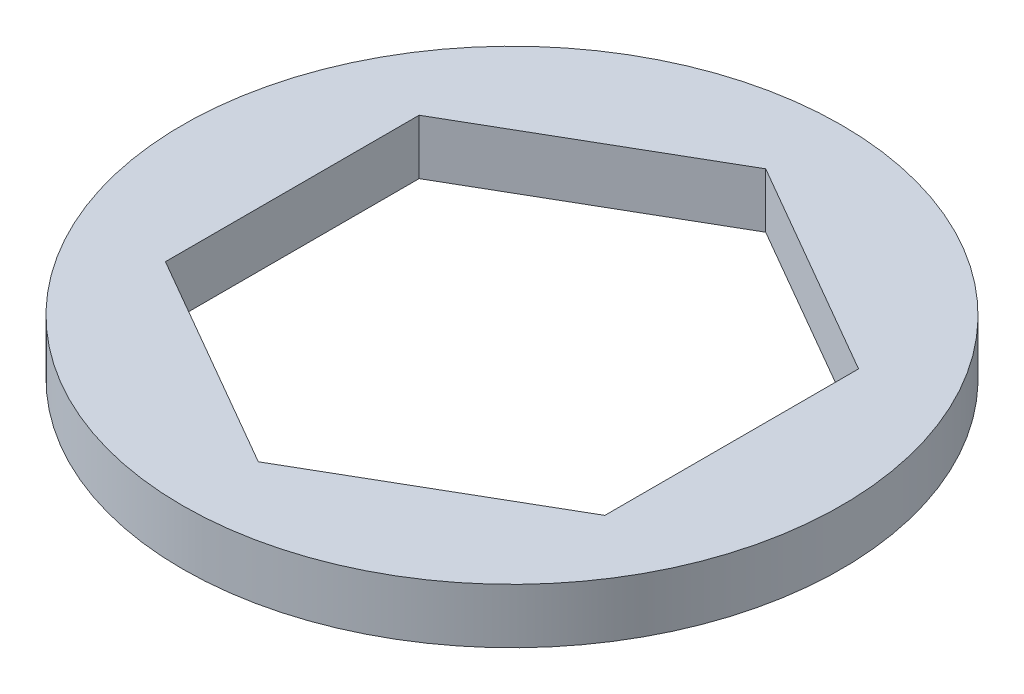
ISO-10303-21;
HEADER;
FILE_DESCRIPTION(('STEP AP214'),'2;1');
FILE_NAME('part.step','',(''),(''),'','','');
FILE_SCHEMA(('AUTOMOTIVE_DESIGN { 1 0 10303 214 1 1 1 1 }'));
ENDSEC;
DATA;
#1=APPLICATION_CONTEXT('core data for automotive mechanical design processes');
#2=APPLICATION_PROTOCOL_DEFINITION('international standard','automotive_design',2000,#1);
#3=PRODUCT_CONTEXT('',#1,'mechanical');
#4=PRODUCT('Part','Part','',(#3));
#5=PRODUCT_RELATED_PRODUCT_CATEGORY('part','',(#4));
#6=PRODUCT_DEFINITION_FORMATION('','',#4);
#7=PRODUCT_DEFINITION_CONTEXT('part definition',#1,'design');
#8=PRODUCT_DEFINITION('design','',#6,#7);
#9=PRODUCT_DEFINITION_SHAPE('','',#8);
#10=(LENGTH_UNIT() NAMED_UNIT(*) SI_UNIT(.MILLI.,.METRE.));
#11=(NAMED_UNIT(*) PLANE_ANGLE_UNIT() SI_UNIT($,.RADIAN.));
#12=(NAMED_UNIT(*) SI_UNIT($,.STERADIAN.) SOLID_ANGLE_UNIT());
#13=UNCERTAINTY_MEASURE_WITH_UNIT(LENGTH_MEASURE(1.E-05),#10,'distance_accuracy_value','');
#14=(GEOMETRIC_REPRESENTATION_CONTEXT(3) GLOBAL_UNCERTAINTY_ASSIGNED_CONTEXT((#13)) GLOBAL_UNIT_ASSIGNED_CONTEXT((#10,
#11,#12)) REPRESENTATION_CONTEXT('',''));
#15=CARTESIAN_POINT('',(0.,0.,0.));
#16=DIRECTION('',(0.,0.,1.));
#17=DIRECTION('',(1.,0.,0.));
#18=AXIS2_PLACEMENT_3D('',#15,#16,#17);
#19=CARTESIAN_POINT('',(0.,1.5875,0.));
#20=DIRECTION('',(0.,1.,0.));
#21=DIRECTION('',(0.,0.,1.));
#22=AXIS2_PLACEMENT_3D('',#19,#20,#21);
#23=PLANE('',#22);
#24=CARTESIAN_POINT('',(0.,1.5875,0.));
#25=DIRECTION('',(0.,1.,0.));
#26=DIRECTION('',(0.,0.,1.));
#27=AXIS2_PLACEMENT_3D('',#24,#25,#26);
#28=CIRCLE('',#27,9.525);
#29=CARTESIAN_POINT('',(0.,1.5875,9.525));
#30=VERTEX_POINT('',#29);
#31=EDGE_CURVE('E11',#30,#30,#28,.T.);
#32=ORIENTED_EDGE('',*,*,#31,.T.);
#33=EDGE_LOOP('',(#32));
#34=FACE_BOUND('',#33,.T.);
#35=DIRECTION('',(-0.866025403784439,0.,-0.5));
#36=VECTOR('',#35,1.);
#37=CARTESIAN_POINT('',(6.35,1.5875,-3.66617420935412));
#38=LINE('',#37,#36);
#39=CARTESIAN_POINT('',(6.35,1.5875,-3.66617420935412));
#40=VERTEX_POINT('',#39);
#41=CARTESIAN_POINT('',(0.,1.5875,-7.33234841870825));
#42=VERTEX_POINT('',#41);
#43=EDGE_CURVE('E98',#40,#42,#38,.T.);
#44=ORIENTED_EDGE('',*,*,#43,.F.);
#45=DIRECTION('',(0.,0.,-1.));
#46=VECTOR('',#45,1.);
#47=CARTESIAN_POINT('',(6.35,1.5875,3.66617420935412));
#48=LINE('',#47,#46);
#49=CARTESIAN_POINT('',(6.35,1.5875,3.66617420935412));
#50=VERTEX_POINT('',#49);
#51=EDGE_CURVE('E90',#50,#40,#48,.T.);
#52=ORIENTED_EDGE('',*,*,#51,.F.);
#53=DIRECTION('',(0.866025403784438,0.,-0.5));
#54=VECTOR('',#53,1.);
#55=CARTESIAN_POINT('',(0.,1.5875,7.33234841870825));
#56=LINE('',#55,#54);
#57=CARTESIAN_POINT('',(0.,1.5875,7.33234841870825));
#58=VERTEX_POINT('',#57);
#59=EDGE_CURVE('E118',#58,#50,#56,.T.);
#60=ORIENTED_EDGE('',*,*,#59,.F.);
#61=DIRECTION('',(0.866025403784439,0.,0.5));
#62=VECTOR('',#61,1.);
#63=CARTESIAN_POINT('',(-6.35,1.5875,3.66617420935413));
#64=LINE('',#63,#62);
#65=CARTESIAN_POINT('',(-6.35,1.5875,3.66617420935413));
#66=VERTEX_POINT('',#65);
#67=EDGE_CURVE('E116',#66,#58,#64,.T.);
#68=ORIENTED_EDGE('',*,*,#67,.F.);
#69=DIRECTION('',(0.,0.,1.));
#70=VECTOR('',#69,1.);
#71=CARTESIAN_POINT('',(-6.35,1.5875,-3.66617420935412));
#72=LINE('',#71,#70);
#73=CARTESIAN_POINT('',(-6.35,1.5875,-3.66617420935412));
#74=VERTEX_POINT('',#73);
#75=EDGE_CURVE('E112',#74,#66,#72,.T.);
#76=ORIENTED_EDGE('',*,*,#75,.F.);
#77=DIRECTION('',(-0.866025403784438,0.,0.5));
#78=VECTOR('',#77,1.);
#79=CARTESIAN_POINT('',(0.,1.5875,-7.33234841870825));
#80=LINE('',#79,#78);
#81=EDGE_CURVE('E110',#42,#74,#80,.T.);
#82=ORIENTED_EDGE('',*,*,#81,.F.);
#83=EDGE_LOOP('',(#44,#52,#60,#68,#76,#82));
#84=FACE_BOUND('',#83,.T.);
#85=ADVANCED_FACE('F37',(#34,#84),#23,.T.);
#86=CARTESIAN_POINT('',(0.,0.,0.));
#87=DIRECTION('',(0.,1.,0.));
#88=DIRECTION('',(0.,0.,1.));
#89=AXIS2_PLACEMENT_3D('',#86,#87,#88);
#90=PLANE('',#89);
#91=CARTESIAN_POINT('',(0.,0.,0.));
#92=DIRECTION('',(0.,1.,0.));
#93=DIRECTION('',(0.,0.,1.));
#94=AXIS2_PLACEMENT_3D('',#91,#92,#93);
#95=CIRCLE('',#94,9.525);
#96=CARTESIAN_POINT('',(0.,0.,9.525));
#97=VERTEX_POINT('',#96);
#98=EDGE_CURVE('E41',#97,#97,#95,.T.);
#99=ORIENTED_EDGE('',*,*,#98,.F.);
#100=EDGE_LOOP('',(#99));
#101=FACE_BOUND('',#100,.T.);
#102=DIRECTION('',(0.,0.,-1.));
#103=VECTOR('',#102,1.);
#104=CARTESIAN_POINT('',(6.35,0.,3.66617420935412));
#105=LINE('',#104,#103);
#106=CARTESIAN_POINT('',(6.35,0.,3.66617420935412));
#107=VERTEX_POINT('',#106);
#108=CARTESIAN_POINT('',(6.35,0.,-3.66617420935412));
#109=VERTEX_POINT('',#108);
#110=EDGE_CURVE('E60',#107,#109,#105,.T.);
#111=ORIENTED_EDGE('',*,*,#110,.T.);
#112=DIRECTION('',(-0.866025403784439,0.,-0.5));
#113=VECTOR('',#112,1.);
#114=CARTESIAN_POINT('',(6.35,0.,-3.66617420935412));
#115=LINE('',#114,#113);
#116=CARTESIAN_POINT('',(0.,0.,-7.33234841870825));
#117=VERTEX_POINT('',#116);
#118=EDGE_CURVE('E105',#109,#117,#115,.T.);
#119=ORIENTED_EDGE('',*,*,#118,.T.);
#120=DIRECTION('',(-0.866025403784438,0.,0.5));
#121=VECTOR('',#120,1.);
#122=CARTESIAN_POINT('',(0.,0.,-7.33234841870825));
#123=LINE('',#122,#121);
#124=CARTESIAN_POINT('',(-6.35,0.,-3.66617420935412));
#125=VERTEX_POINT('',#124);
#126=EDGE_CURVE('E122',#117,#125,#123,.T.);
#127=ORIENTED_EDGE('',*,*,#126,.T.);
#128=DIRECTION('',(0.,0.,1.));
#129=VECTOR('',#128,1.);
#130=CARTESIAN_POINT('',(-6.35,0.,-3.66617420935412));
#131=LINE('',#130,#129);
#132=CARTESIAN_POINT('',(-6.35,0.,3.66617420935413));
#133=VERTEX_POINT('',#132);
#134=EDGE_CURVE('E125',#125,#133,#131,.T.);
#135=ORIENTED_EDGE('',*,*,#134,.T.);
#136=DIRECTION('',(0.866025403784439,0.,0.5));
#137=VECTOR('',#136,1.);
#138=CARTESIAN_POINT('',(-6.35,0.,3.66617420935413));
#139=LINE('',#138,#137);
#140=CARTESIAN_POINT('',(0.,0.,7.33234841870825));
#141=VERTEX_POINT('',#140);
#142=EDGE_CURVE('E128',#133,#141,#139,.T.);
#143=ORIENTED_EDGE('',*,*,#142,.T.);
#144=DIRECTION('',(0.866025403784438,0.,-0.5));
#145=VECTOR('',#144,1.);
#146=CARTESIAN_POINT('',(0.,0.,7.33234841870825));
#147=LINE('',#146,#145);
#148=EDGE_CURVE('E99',#141,#107,#147,.T.);
#149=ORIENTED_EDGE('',*,*,#148,.T.);
#150=EDGE_LOOP('',(#111,#119,#127,#135,#143,#149));
#151=FACE_BOUND('',#150,.T.);
#152=ADVANCED_FACE('F145',(#101,#151),#90,.F.);
#153=CARTESIAN_POINT('',(0.,1.5875,0.));
#154=DIRECTION('',(0.,-1.,0.));
#155=DIRECTION('',(0.,0.,-1.));
#156=AXIS2_PLACEMENT_3D('',#153,#154,#155);
#157=CYLINDRICAL_SURFACE('',#156,9.525);
#158=ORIENTED_EDGE('',*,*,#31,.F.);
#159=EDGE_LOOP('',(#158));
#160=FACE_BOUND('',#159,.T.);
#161=ORIENTED_EDGE('',*,*,#98,.T.);
#162=EDGE_LOOP('',(#161));
#163=FACE_BOUND('',#162,.T.);
#164=ADVANCED_FACE('F39',(#160,#163),#157,.T.);
#165=CARTESIAN_POINT('',(6.35,1.5875,3.66617420935412));
#166=DIRECTION('',(-1.,0.,0.));
#167=DIRECTION('',(0.,0.,1.));
#168=AXIS2_PLACEMENT_3D('',#165,#166,#167);
#169=PLANE('',#168);
#170=ORIENTED_EDGE('',*,*,#110,.F.);
#171=DIRECTION('',(0.,-1.,0.));
#172=VECTOR('',#171,1.);
#173=CARTESIAN_POINT('',(6.35,1.5875,3.66617420935412));
#174=LINE('',#173,#172);
#175=EDGE_CURVE('E94',#50,#107,#174,.T.);
#176=ORIENTED_EDGE('',*,*,#175,.F.);
#177=ORIENTED_EDGE('',*,*,#51,.T.);
#178=DIRECTION('',(0.,-1.,0.));
#179=VECTOR('',#178,1.);
#180=CARTESIAN_POINT('',(6.35,1.5875,-3.66617420935412));
#181=LINE('',#180,#179);
#182=EDGE_CURVE('E93',#40,#109,#181,.T.);
#183=ORIENTED_EDGE('',*,*,#182,.T.);
#184=EDGE_LOOP('',(#170,#176,#177,#183));
#185=FACE_BOUND('',#184,.T.);
#186=ADVANCED_FACE('F92',(#185),#169,.T.);
#187=CARTESIAN_POINT('',(6.35,1.5875,-3.66617420935412));
#188=DIRECTION('',(-0.5,0.,0.866025403784439));
#189=DIRECTION('',(0.866025403784439,0.,0.5));
#190=AXIS2_PLACEMENT_3D('',#187,#188,#189);
#191=PLANE('',#190);
#192=ORIENTED_EDGE('',*,*,#118,.F.);
#193=ORIENTED_EDGE('',*,*,#182,.F.);
#194=ORIENTED_EDGE('',*,*,#43,.T.);
#195=DIRECTION('',(0.,-1.,0.));
#196=VECTOR('',#195,1.);
#197=CARTESIAN_POINT('',(0.,1.5875,-7.33234841870825));
#198=LINE('',#197,#196);
#199=EDGE_CURVE('E106',#42,#117,#198,.T.);
#200=ORIENTED_EDGE('',*,*,#199,.T.);
#201=EDGE_LOOP('',(#192,#193,#194,#200));
#202=FACE_BOUND('',#201,.T.);
#203=ADVANCED_FACE('F102',(#202),#191,.T.);
#204=CARTESIAN_POINT('',(0.,1.5875,-7.33234841870825));
#205=DIRECTION('',(0.5,0.,0.866025403784438));
#206=DIRECTION('',(0.866025403784438,0.,-0.5));
#207=AXIS2_PLACEMENT_3D('',#204,#205,#206);
#208=PLANE('',#207);
#209=ORIENTED_EDGE('',*,*,#126,.F.);
#210=ORIENTED_EDGE('',*,*,#199,.F.);
#211=ORIENTED_EDGE('',*,*,#81,.T.);
#212=DIRECTION('',(0.,-1.,0.));
#213=VECTOR('',#212,1.);
#214=CARTESIAN_POINT('',(-6.35,1.5875,-3.66617420935412));
#215=LINE('',#214,#213);
#216=EDGE_CURVE('E137',#74,#125,#215,.T.);
#217=ORIENTED_EDGE('',*,*,#216,.T.);
#218=EDGE_LOOP('',(#209,#210,#211,#217));
#219=FACE_BOUND('',#218,.T.);
#220=ADVANCED_FACE('F141',(#219),#208,.T.);
#221=CARTESIAN_POINT('',(-6.35,1.5875,-3.66617420935412));
#222=DIRECTION('',(1.,0.,0.));
#223=DIRECTION('',(0.,0.,-1.));
#224=AXIS2_PLACEMENT_3D('',#221,#222,#223);
#225=PLANE('',#224);
#226=ORIENTED_EDGE('',*,*,#134,.F.);
#227=ORIENTED_EDGE('',*,*,#216,.F.);
#228=ORIENTED_EDGE('',*,*,#75,.T.);
#229=DIRECTION('',(0.,-1.,0.));
#230=VECTOR('',#229,1.);
#231=CARTESIAN_POINT('',(-6.35,1.5875,3.66617420935413));
#232=LINE('',#231,#230);
#233=EDGE_CURVE('E135',#66,#133,#232,.T.);
#234=ORIENTED_EDGE('',*,*,#233,.T.);
#235=EDGE_LOOP('',(#226,#227,#228,#234));
#236=FACE_BOUND('',#235,.T.);
#237=ADVANCED_FACE('F153',(#236),#225,.T.);
#238=CARTESIAN_POINT('',(-6.35,1.5875,3.66617420935413));
#239=DIRECTION('',(0.5,0.,-0.866025403784439));
#240=DIRECTION('',(-0.866025403784439,0.,-0.5));
#241=AXIS2_PLACEMENT_3D('',#238,#239,#240);
#242=PLANE('',#241);
#243=ORIENTED_EDGE('',*,*,#142,.F.);
#244=ORIENTED_EDGE('',*,*,#233,.F.);
#245=ORIENTED_EDGE('',*,*,#67,.T.);
#246=DIRECTION('',(0.,-1.,0.));
#247=VECTOR('',#246,1.);
#248=CARTESIAN_POINT('',(0.,1.5875,7.33234841870825));
#249=LINE('',#248,#247);
#250=EDGE_CURVE('E52',#58,#141,#249,.T.);
#251=ORIENTED_EDGE('',*,*,#250,.T.);
#252=EDGE_LOOP('',(#243,#244,#245,#251));
#253=FACE_BOUND('',#252,.T.);
#254=ADVANCED_FACE('F151',(#253),#242,.T.);
#255=CARTESIAN_POINT('',(0.,1.5875,7.33234841870825));
#256=DIRECTION('',(-0.5,0.,-0.866025403784439));
#257=DIRECTION('',(-0.866025403784439,0.,0.5));
#258=AXIS2_PLACEMENT_3D('',#255,#256,#257);
#259=PLANE('',#258);
#260=ORIENTED_EDGE('',*,*,#148,.F.);
#261=ORIENTED_EDGE('',*,*,#250,.F.);
#262=ORIENTED_EDGE('',*,*,#59,.T.);
#263=ORIENTED_EDGE('',*,*,#175,.T.);
#264=EDGE_LOOP('',(#260,#261,#262,#263));
#265=FACE_BOUND('',#264,.T.);
#266=ADVANCED_FACE('F147',(#265),#259,.T.);
#267=CLOSED_SHELL('',(#85,#152,#164,#186,#203,#220,#237,#254,#266));
#268=MANIFOLD_SOLID_BREP('B2',#267);
#269=ADVANCED_BREP_SHAPE_REPRESENTATION('',(#18,#268),#14);
#270=SHAPE_DEFINITION_REPRESENTATION(#9,#269);
ENDSEC;
END-ISO-10303-21;
